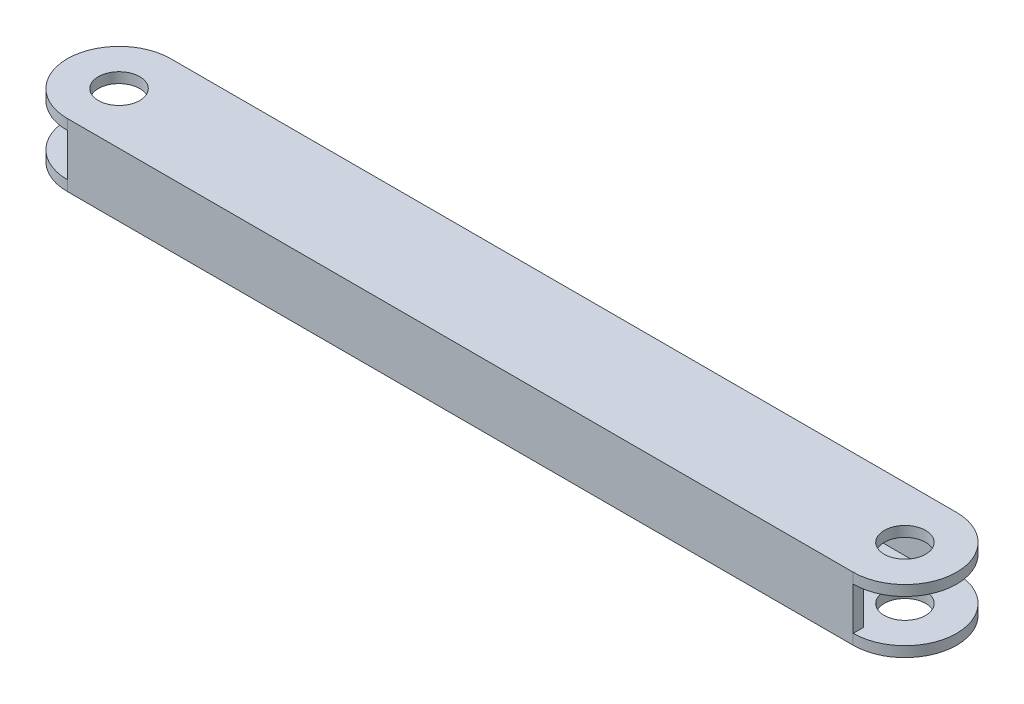
ISO-10303-21;
HEADER;
FILE_DESCRIPTION(('STEP AP214'),'2;1');
FILE_NAME('part.step','',(''),(''),'','','');
FILE_SCHEMA(('AUTOMOTIVE_DESIGN { 1 0 10303 214 1 1 1 1 }'));
ENDSEC;
DATA;
#1=APPLICATION_CONTEXT('core data for automotive mechanical design processes');
#2=APPLICATION_PROTOCOL_DEFINITION('international standard','automotive_design',2000,#1);
#3=PRODUCT_CONTEXT('',#1,'mechanical');
#4=PRODUCT('Part','Part','',(#3));
#5=PRODUCT_RELATED_PRODUCT_CATEGORY('part','',(#4));
#6=PRODUCT_DEFINITION_FORMATION('','',#4);
#7=PRODUCT_DEFINITION_CONTEXT('part definition',#1,'design');
#8=PRODUCT_DEFINITION('design','',#6,#7);
#9=PRODUCT_DEFINITION_SHAPE('','',#8);
#10=(LENGTH_UNIT() NAMED_UNIT(*) SI_UNIT(.MILLI.,.METRE.));
#11=(NAMED_UNIT(*) PLANE_ANGLE_UNIT() SI_UNIT($,.RADIAN.));
#12=(NAMED_UNIT(*) SI_UNIT($,.STERADIAN.) SOLID_ANGLE_UNIT());
#13=UNCERTAINTY_MEASURE_WITH_UNIT(LENGTH_MEASURE(1.E-05),#10,'distance_accuracy_value','');
#14=(GEOMETRIC_REPRESENTATION_CONTEXT(3) GLOBAL_UNCERTAINTY_ASSIGNED_CONTEXT((#13)) GLOBAL_UNIT_ASSIGNED_CONTEXT((#10,
#11,#12)) REPRESENTATION_CONTEXT('',''));
#15=CARTESIAN_POINT('',(0.,0.,0.));
#16=DIRECTION('',(0.,0.,1.));
#17=DIRECTION('',(1.,0.,0.));
#18=AXIS2_PLACEMENT_3D('',#15,#16,#17);
#19=CARTESIAN_POINT('',(-31.9840145157425,6.11675332334781,5.));
#20=DIRECTION('',(0.,1.,0.));
#21=DIRECTION('',(0.,0.,1.));
#22=AXIS2_PLACEMENT_3D('',#19,#20,#21);
#23=CYLINDRICAL_SURFACE('',#22,5.);
#24=DIRECTION('',(0.,1.,0.));
#25=VECTOR('',#24,1.);
#26=CARTESIAN_POINT('',(-31.9840145157425,0.,0.));
#27=LINE('',#26,#25);
#28=CARTESIAN_POINT('',(-31.9840145157425,5.11675332334781,0.));
#29=VERTEX_POINT('',#28);
#30=CARTESIAN_POINT('',(-31.9840145157425,6.11675332334781,0.));
#31=VERTEX_POINT('',#30);
#32=EDGE_CURVE('E252',#29,#31,#27,.T.);
#33=ORIENTED_EDGE('',*,*,#32,.F.);
#34=CARTESIAN_POINT('',(-31.9840145157425,5.11675332334781,5.));
#35=DIRECTION('',(0.,1.,0.));
#36=DIRECTION('',(0.,0.,1.));
#37=AXIS2_PLACEMENT_3D('',#34,#35,#36);
#38=CIRCLE('',#37,5.);
#39=CARTESIAN_POINT('',(-31.9840145157425,5.11675332334781,10.));
#40=VERTEX_POINT('',#39);
#41=EDGE_CURVE('E178',#29,#40,#38,.T.);
#42=ORIENTED_EDGE('',*,*,#41,.T.);
#43=DIRECTION('',(0.,-1.,0.));
#44=VECTOR('',#43,1.);
#45=CARTESIAN_POINT('',(-31.9840145157425,6.11675332334781,10.));
#46=LINE('',#45,#44);
#47=CARTESIAN_POINT('',(-31.9840145157425,6.11675332334781,10.));
#48=VERTEX_POINT('',#47);
#49=EDGE_CURVE('E249',#48,#40,#46,.T.);
#50=ORIENTED_EDGE('',*,*,#49,.F.);
#51=CARTESIAN_POINT('',(-31.9840145157425,6.11675332334781,5.));
#52=DIRECTION('',(0.,1.,0.));
#53=DIRECTION('',(0.,0.,1.));
#54=AXIS2_PLACEMENT_3D('',#51,#52,#53);
#55=CIRCLE('',#54,5.);
#56=EDGE_CURVE('E49',#31,#48,#55,.T.);
#57=ORIENTED_EDGE('',*,*,#56,.F.);
#58=EDGE_LOOP('',(#33,#42,#50,#57));
#59=FACE_BOUND('',#58,.T.);
#60=ADVANCED_FACE('F41',(#59),#23,.T.);
#61=CARTESIAN_POINT('',(-31.9840145157425,1.,10.));
#62=VERTEX_POINT('',#61);
#63=CARTESIAN_POINT('',(-31.9840145157425,0.,10.));
#64=VERTEX_POINT('',#63);
#65=EDGE_CURVE('E248',#62,#64,#46,.T.);
#66=ORIENTED_EDGE('',*,*,#65,.F.);
#67=CARTESIAN_POINT('',(-31.9840145157425,1.,5.));
#68=DIRECTION('',(0.,1.,0.));
#69=DIRECTION('',(0.,0.,1.));
#70=AXIS2_PLACEMENT_3D('',#67,#68,#69);
#71=CIRCLE('',#70,5.);
#72=CARTESIAN_POINT('',(-31.9840145157425,1.,0.));
#73=VERTEX_POINT('',#72);
#74=EDGE_CURVE('E135',#62,#73,#71,.F.);
#75=ORIENTED_EDGE('',*,*,#74,.T.);
#76=CARTESIAN_POINT('',(-31.9840145157425,0.,0.));
#77=VERTEX_POINT('',#76);
#78=EDGE_CURVE('E253',#77,#73,#27,.T.);
#79=ORIENTED_EDGE('',*,*,#78,.F.);
#80=CARTESIAN_POINT('',(-31.9840145157425,0.,5.));
#81=DIRECTION('',(0.,1.,0.));
#82=DIRECTION('',(0.,0.,1.));
#83=AXIS2_PLACEMENT_3D('',#80,#81,#82);
#84=CIRCLE('',#83,5.);
#85=EDGE_CURVE('E11',#64,#77,#84,.F.);
#86=ORIENTED_EDGE('',*,*,#85,.F.);
#87=EDGE_LOOP('',(#66,#75,#79,#86));
#88=FACE_BOUND('',#87,.T.);
#89=ADVANCED_FACE('F292',(#88),#23,.T.);
#90=CARTESIAN_POINT('',(43.9647617048358,0.,5.));
#91=DIRECTION('',(0.,1.,0.));
#92=DIRECTION('',(0.,0.,1.));
#93=AXIS2_PLACEMENT_3D('',#90,#91,#92);
#94=CYLINDRICAL_SURFACE('',#93,5.);
#95=DIRECTION('',(0.,-1.,0.));
#96=VECTOR('',#95,1.);
#97=CARTESIAN_POINT('',(43.9647617048358,0.,0.));
#98=LINE('',#97,#96);
#99=CARTESIAN_POINT('',(43.9647617048358,1.,0.));
#100=VERTEX_POINT('',#99);
#101=CARTESIAN_POINT('',(43.9647617048358,0.,0.));
#102=VERTEX_POINT('',#101);
#103=EDGE_CURVE('E238',#100,#102,#98,.T.);
#104=ORIENTED_EDGE('',*,*,#103,.F.);
#105=CARTESIAN_POINT('',(43.9647617048358,1.,5.));
#106=DIRECTION('',(0.,1.,0.));
#107=DIRECTION('',(0.,0.,1.));
#108=AXIS2_PLACEMENT_3D('',#105,#106,#107);
#109=CIRCLE('',#108,5.);
#110=CARTESIAN_POINT('',(43.9647617048358,1.,10.));
#111=VERTEX_POINT('',#110);
#112=EDGE_CURVE('E200',#100,#111,#109,.F.);
#113=ORIENTED_EDGE('',*,*,#112,.T.);
#114=DIRECTION('',(0.,1.,0.));
#115=VECTOR('',#114,1.);
#116=CARTESIAN_POINT('',(43.9647617048358,0.,10.));
#117=LINE('',#116,#115);
#118=CARTESIAN_POINT('',(43.9647617048358,0.,10.));
#119=VERTEX_POINT('',#118);
#120=EDGE_CURVE('E235',#119,#111,#117,.T.);
#121=ORIENTED_EDGE('',*,*,#120,.F.);
#122=CARTESIAN_POINT('',(43.9647617048358,0.,5.));
#123=DIRECTION('',(0.,1.,0.));
#124=DIRECTION('',(0.,0.,1.));
#125=AXIS2_PLACEMENT_3D('',#122,#123,#124);
#126=CIRCLE('',#125,5.);
#127=EDGE_CURVE('E242',#102,#119,#126,.F.);
#128=ORIENTED_EDGE('',*,*,#127,.F.);
#129=EDGE_LOOP('',(#104,#113,#121,#128));
#130=FACE_BOUND('',#129,.T.);
#131=ADVANCED_FACE('F286',(#130),#94,.T.);
#132=CARTESIAN_POINT('',(43.9647617048358,5.11675332334781,10.));
#133=VERTEX_POINT('',#132);
#134=CARTESIAN_POINT('',(43.9647617048358,6.11675332334781,10.));
#135=VERTEX_POINT('',#134);
#136=EDGE_CURVE('E231',#133,#135,#117,.T.);
#137=ORIENTED_EDGE('',*,*,#136,.F.);
#138=CARTESIAN_POINT('',(43.9647617048358,5.11675332334781,5.));
#139=DIRECTION('',(0.,1.,0.));
#140=DIRECTION('',(0.,0.,1.));
#141=AXIS2_PLACEMENT_3D('',#138,#139,#140);
#142=CIRCLE('',#141,5.);
#143=CARTESIAN_POINT('',(43.9647617048358,5.11675332334781,0.));
#144=VERTEX_POINT('',#143);
#145=EDGE_CURVE('E196',#133,#144,#142,.T.);
#146=ORIENTED_EDGE('',*,*,#145,.T.);
#147=CARTESIAN_POINT('',(43.9647617048358,6.11675332334781,0.));
#148=VERTEX_POINT('',#147);
#149=EDGE_CURVE('E239',#148,#144,#98,.T.);
#150=ORIENTED_EDGE('',*,*,#149,.F.);
#151=CARTESIAN_POINT('',(43.9647617048358,6.11675332334781,5.));
#152=DIRECTION('',(0.,1.,0.));
#153=DIRECTION('',(0.,0.,1.));
#154=AXIS2_PLACEMENT_3D('',#151,#152,#153);
#155=CIRCLE('',#154,5.);
#156=EDGE_CURVE('E245',#135,#148,#155,.T.);
#157=ORIENTED_EDGE('',*,*,#156,.F.);
#158=EDGE_LOOP('',(#137,#146,#150,#157));
#159=FACE_BOUND('',#158,.T.);
#160=ADVANCED_FACE('F269',(#159),#94,.T.);
#161=CARTESIAN_POINT('',(-31.9840145157425,-3.88324667665219,5.));
#162=DIRECTION('',(0.,1.,0.));
#163=DIRECTION('',(0.,0.,1.));
#164=AXIS2_PLACEMENT_3D('',#161,#162,#163);
#165=CYLINDRICAL_SURFACE('',#164,2.);
#166=CARTESIAN_POINT('',(-31.9840145157425,6.11675332334781,5.));
#167=DIRECTION('',(0.,1.,0.));
#168=DIRECTION('',(0.,0.,1.));
#169=AXIS2_PLACEMENT_3D('',#166,#167,#168);
#170=CIRCLE('',#169,2.);
#171=CARTESIAN_POINT('',(-31.9840145157425,6.11675332334781,7.));
#172=VERTEX_POINT('',#171);
#173=EDGE_CURVE('E191',#172,#172,#170,.T.);
#174=ORIENTED_EDGE('',*,*,#173,.T.);
#175=EDGE_LOOP('',(#174));
#176=FACE_BOUND('',#175,.T.);
#177=CARTESIAN_POINT('',(-31.9840145157425,5.11675332334781,5.));
#178=DIRECTION('',(0.,1.,0.));
#179=DIRECTION('',(0.,0.,1.));
#180=AXIS2_PLACEMENT_3D('',#177,#178,#179);
#181=CIRCLE('',#180,2.);
#182=CARTESIAN_POINT('',(-31.9840145157425,5.11675332334781,7.));
#183=VERTEX_POINT('',#182);
#184=EDGE_CURVE('E208',#183,#183,#181,.T.);
#185=ORIENTED_EDGE('',*,*,#184,.F.);
#186=EDGE_LOOP('',(#185));
#187=FACE_BOUND('',#186,.T.);
#188=ADVANCED_FACE('F348',(#176,#187),#165,.F.);
#189=CARTESIAN_POINT('',(43.9647617048359,-3.88324667665219,5.));
#190=DIRECTION('',(0.,1.,0.));
#191=DIRECTION('',(0.,0.,1.));
#192=AXIS2_PLACEMENT_3D('',#189,#190,#191);
#193=CYLINDRICAL_SURFACE('',#192,2.);
#194=CARTESIAN_POINT('',(43.9647617048359,6.11675332334781,5.));
#195=DIRECTION('',(0.,1.,0.));
#196=DIRECTION('',(0.,0.,1.));
#197=AXIS2_PLACEMENT_3D('',#194,#195,#196);
#198=CIRCLE('',#197,2.);
#199=CARTESIAN_POINT('',(43.9647617048359,6.11675332334781,7.));
#200=VERTEX_POINT('',#199);
#201=EDGE_CURVE('E213',#200,#200,#198,.T.);
#202=ORIENTED_EDGE('',*,*,#201,.T.);
#203=EDGE_LOOP('',(#202));
#204=FACE_BOUND('',#203,.T.);
#205=CARTESIAN_POINT('',(43.9647617048359,5.11675332334781,5.));
#206=DIRECTION('',(0.,1.,0.));
#207=DIRECTION('',(0.,0.,1.));
#208=AXIS2_PLACEMENT_3D('',#205,#206,#207);
#209=CIRCLE('',#208,2.);
#210=CARTESIAN_POINT('',(43.9647617048359,5.11675332334781,7.));
#211=VERTEX_POINT('',#210);
#212=EDGE_CURVE('E174',#211,#211,#209,.T.);
#213=ORIENTED_EDGE('',*,*,#212,.F.);
#214=EDGE_LOOP('',(#213));
#215=FACE_BOUND('',#214,.T.);
#216=ADVANCED_FACE('F315',(#204,#215),#193,.F.);
#217=CARTESIAN_POINT('',(-36.9840145157425,0.,10.));
#218=DIRECTION('',(0.,1.,0.));
#219=DIRECTION('',(0.,0.,1.));
#220=AXIS2_PLACEMENT_3D('',#217,#218,#219);
#221=PLANE('',#220);
#222=CARTESIAN_POINT('',(43.9647617048359,0.,5.));
#223=DIRECTION('',(0.,1.,0.));
#224=DIRECTION('',(0.,0.,1.));
#225=AXIS2_PLACEMENT_3D('',#222,#223,#224);
#226=CIRCLE('',#225,2.);
#227=CARTESIAN_POINT('',(43.9647617048359,0.,7.));
#228=VERTEX_POINT('',#227);
#229=EDGE_CURVE('E221',#228,#228,#226,.T.);
#230=ORIENTED_EDGE('',*,*,#229,.T.);
#231=EDGE_LOOP('',(#230));
#232=FACE_BOUND('',#231,.T.);
#233=CARTESIAN_POINT('',(-31.9840145157425,0.,5.));
#234=DIRECTION('',(0.,1.,0.));
#235=DIRECTION('',(0.,0.,1.));
#236=AXIS2_PLACEMENT_3D('',#233,#234,#235);
#237=CIRCLE('',#236,2.);
#238=CARTESIAN_POINT('',(-31.9840145157425,0.,7.));
#239=VERTEX_POINT('',#238);
#240=EDGE_CURVE('E216',#239,#239,#237,.T.);
#241=ORIENTED_EDGE('',*,*,#240,.T.);
#242=EDGE_LOOP('',(#241));
#243=FACE_BOUND('',#242,.T.);
#244=DIRECTION('',(1.,0.,0.));
#245=VECTOR('',#244,1.);
#246=CARTESIAN_POINT('',(-36.9840145157425,0.,10.));
#247=LINE('',#246,#245);
#248=EDGE_CURVE('E228',#64,#119,#247,.T.);
#249=ORIENTED_EDGE('',*,*,#248,.F.);
#250=ORIENTED_EDGE('',*,*,#85,.T.);
#251=DIRECTION('',(1.,0.,0.));
#252=VECTOR('',#251,1.);
#253=CARTESIAN_POINT('',(-36.9840145157425,0.,0.));
#254=LINE('',#253,#252);
#255=EDGE_CURVE('E229',#77,#102,#254,.T.);
#256=ORIENTED_EDGE('',*,*,#255,.T.);
#257=ORIENTED_EDGE('',*,*,#127,.T.);
#258=EDGE_LOOP('',(#249,#250,#256,#257));
#259=FACE_BOUND('',#258,.T.);
#260=ADVANCED_FACE('F290',(#232,#243,#259),#221,.F.);
#261=CARTESIAN_POINT('',(-36.9840145157425,6.11675332334781,10.));
#262=DIRECTION('',(0.,1.,0.));
#263=DIRECTION('',(0.,0.,1.));
#264=AXIS2_PLACEMENT_3D('',#261,#262,#263);
#265=PLANE('',#264);
#266=ORIENTED_EDGE('',*,*,#201,.F.);
#267=EDGE_LOOP('',(#266));
#268=FACE_BOUND('',#267,.T.);
#269=ORIENTED_EDGE('',*,*,#173,.F.);
#270=EDGE_LOOP('',(#269));
#271=FACE_BOUND('',#270,.T.);
#272=DIRECTION('',(1.,0.,0.));
#273=VECTOR('',#272,1.);
#274=CARTESIAN_POINT('',(-36.9840145157425,6.11675332334781,0.));
#275=LINE('',#274,#273);
#276=EDGE_CURVE('E224',#31,#148,#275,.T.);
#277=ORIENTED_EDGE('',*,*,#276,.F.);
#278=ORIENTED_EDGE('',*,*,#56,.T.);
#279=DIRECTION('',(1.,0.,0.));
#280=VECTOR('',#279,1.);
#281=CARTESIAN_POINT('',(-36.9840145157425,6.11675332334781,10.));
#282=LINE('',#281,#280);
#283=EDGE_CURVE('E225',#48,#135,#282,.T.);
#284=ORIENTED_EDGE('',*,*,#283,.T.);
#285=ORIENTED_EDGE('',*,*,#156,.T.);
#286=EDGE_LOOP('',(#277,#278,#284,#285));
#287=FACE_BOUND('',#286,.T.);
#288=ADVANCED_FACE('F259',(#268,#271,#287),#265,.T.);
#289=CARTESIAN_POINT('',(0.,0.,10.));
#290=DIRECTION('',(0.,0.,-1.));
#291=DIRECTION('',(-1.,0.,0.));
#292=AXIS2_PLACEMENT_3D('',#289,#290,#291);
#293=PLANE('',#292);
#294=ORIENTED_EDGE('',*,*,#283,.F.);
#295=ORIENTED_EDGE('',*,*,#49,.T.);
#296=DIRECTION('',(0.,-1.,0.));
#297=VECTOR('',#296,1.);
#298=CARTESIAN_POINT('',(-31.9840145157425,6.11675332334781,10.));
#299=LINE('',#298,#297);
#300=EDGE_CURVE('E199',#40,#62,#299,.T.);
#301=ORIENTED_EDGE('',*,*,#300,.T.);
#302=ORIENTED_EDGE('',*,*,#65,.T.);
#303=ORIENTED_EDGE('',*,*,#248,.T.);
#304=ORIENTED_EDGE('',*,*,#120,.T.);
#305=DIRECTION('',(0.,1.,0.));
#306=VECTOR('',#305,1.);
#307=CARTESIAN_POINT('',(43.9647617048358,0.,10.));
#308=LINE('',#307,#306);
#309=EDGE_CURVE('E153',#111,#133,#308,.T.);
#310=ORIENTED_EDGE('',*,*,#309,.T.);
#311=ORIENTED_EDGE('',*,*,#136,.T.);
#312=EDGE_LOOP('',(#294,#295,#301,#302,#303,#304,#310,#311));
#313=FACE_BOUND('',#312,.T.);
#314=ADVANCED_FACE('F266',(#313),#293,.F.);
#315=CARTESIAN_POINT('',(0.,0.,0.));
#316=DIRECTION('',(0.,0.,-1.));
#317=DIRECTION('',(-1.,0.,0.));
#318=AXIS2_PLACEMENT_3D('',#315,#316,#317);
#319=PLANE('',#318);
#320=ORIENTED_EDGE('',*,*,#255,.F.);
#321=ORIENTED_EDGE('',*,*,#78,.T.);
#322=DIRECTION('',(0.,1.,0.));
#323=VECTOR('',#322,1.);
#324=CARTESIAN_POINT('',(-31.9840145157425,0.,0.));
#325=LINE('',#324,#323);
#326=EDGE_CURVE('E163',#73,#29,#325,.T.);
#327=ORIENTED_EDGE('',*,*,#326,.T.);
#328=ORIENTED_EDGE('',*,*,#32,.T.);
#329=ORIENTED_EDGE('',*,*,#276,.T.);
#330=ORIENTED_EDGE('',*,*,#149,.T.);
#331=DIRECTION('',(0.,-1.,0.));
#332=VECTOR('',#331,1.);
#333=CARTESIAN_POINT('',(43.9647617048358,0.,0.));
#334=LINE('',#333,#332);
#335=EDGE_CURVE('E157',#144,#100,#334,.T.);
#336=ORIENTED_EDGE('',*,*,#335,.T.);
#337=ORIENTED_EDGE('',*,*,#103,.T.);
#338=EDGE_LOOP('',(#320,#321,#327,#328,#329,#330,#336,#337));
#339=FACE_BOUND('',#338,.T.);
#340=ADVANCED_FACE('F274',(#339),#319,.T.);
#341=CARTESIAN_POINT('',(-31.9840145157425,1.,5.));
#342=DIRECTION('',(0.,1.,0.));
#343=DIRECTION('',(0.,0.,1.));
#344=AXIS2_PLACEMENT_3D('',#341,#342,#343);
#345=CIRCLE('',#344,2.);
#346=CARTESIAN_POINT('',(-31.9840145157425,1.,7.));
#347=VERTEX_POINT('',#346);
#348=EDGE_CURVE('E172',#347,#347,#345,.T.);
#349=ORIENTED_EDGE('',*,*,#348,.T.);
#350=EDGE_LOOP('',(#349));
#351=FACE_BOUND('',#350,.T.);
#352=ORIENTED_EDGE('',*,*,#240,.F.);
#353=EDGE_LOOP('',(#352));
#354=FACE_BOUND('',#353,.T.);
#355=ADVANCED_FACE('F336',(#351,#354),#165,.F.);
#356=CARTESIAN_POINT('',(43.9647617048359,1.,5.));
#357=DIRECTION('',(0.,1.,0.));
#358=DIRECTION('',(0.,0.,1.));
#359=AXIS2_PLACEMENT_3D('',#356,#357,#358);
#360=CIRCLE('',#359,2.);
#361=CARTESIAN_POINT('',(43.9647617048359,1.,7.));
#362=VERTEX_POINT('',#361);
#363=EDGE_CURVE('E169',#362,#362,#360,.T.);
#364=ORIENTED_EDGE('',*,*,#363,.T.);
#365=EDGE_LOOP('',(#364));
#366=FACE_BOUND('',#365,.T.);
#367=ORIENTED_EDGE('',*,*,#229,.F.);
#368=EDGE_LOOP('',(#367));
#369=FACE_BOUND('',#368,.T.);
#370=ADVANCED_FACE('F345',(#366,#369),#193,.F.);
#371=CARTESIAN_POINT('',(43.9647617048358,3.0583766616739,0.));
#372=DIRECTION('',(1.,0.,0.));
#373=DIRECTION('',(0.,-1.,0.));
#374=AXIS2_PLACEMENT_3D('',#371,#372,#373);
#375=PLANE('',#374);
#376=ORIENTED_EDGE('',*,*,#335,.F.);
#377=DIRECTION('',(0.,0.,1.));
#378=VECTOR('',#377,1.);
#379=CARTESIAN_POINT('',(43.9647617048358,5.11675332334781,0.));
#380=LINE('',#379,#378);
#381=CARTESIAN_POINT('',(43.9647617048358,5.11675332334781,1.));
#382=VERTEX_POINT('',#381);
#383=EDGE_CURVE('E64',#382,#144,#380,.F.);
#384=ORIENTED_EDGE('',*,*,#383,.F.);
#385=DIRECTION('',(0.,1.,0.));
#386=VECTOR('',#385,1.);
#387=CARTESIAN_POINT('',(43.9647617048358,3.0583766616739,1.));
#388=LINE('',#387,#386);
#389=CARTESIAN_POINT('',(43.9647617048358,1.,1.));
#390=VERTEX_POINT('',#389);
#391=EDGE_CURVE('E177',#382,#390,#388,.F.);
#392=ORIENTED_EDGE('',*,*,#391,.T.);
#393=DIRECTION('',(0.,0.,1.));
#394=VECTOR('',#393,1.);
#395=CARTESIAN_POINT('',(43.9647617048358,1.,0.));
#396=LINE('',#395,#394);
#397=EDGE_CURVE('E188',#390,#100,#396,.F.);
#398=ORIENTED_EDGE('',*,*,#397,.T.);
#399=EDGE_LOOP('',(#376,#384,#392,#398));
#400=FACE_BOUND('',#399,.T.);
#401=ADVANCED_FACE('F355',(#400),#375,.T.);
#402=CARTESIAN_POINT('',(43.9647617048358,3.0583766616739,10.));
#403=DIRECTION('',(1.,0.,0.));
#404=DIRECTION('',(0.,1.,0.));
#405=AXIS2_PLACEMENT_3D('',#402,#403,#404);
#406=PLANE('',#405);
#407=ORIENTED_EDGE('',*,*,#309,.F.);
#408=DIRECTION('',(0.,0.,1.));
#409=VECTOR('',#408,1.);
#410=CARTESIAN_POINT('',(43.9647617048358,1.,10.));
#411=LINE('',#410,#409);
#412=CARTESIAN_POINT('',(43.9647617048358,1.,9.));
#413=VERTEX_POINT('',#412);
#414=EDGE_CURVE('E184',#413,#111,#411,.T.);
#415=ORIENTED_EDGE('',*,*,#414,.F.);
#416=DIRECTION('',(0.,-1.,0.));
#417=VECTOR('',#416,1.);
#418=CARTESIAN_POINT('',(43.9647617048358,0.,9.));
#419=LINE('',#418,#417);
#420=CARTESIAN_POINT('',(43.9647617048358,5.11675332334781,9.));
#421=VERTEX_POINT('',#420);
#422=EDGE_CURVE('E152',#413,#421,#419,.F.);
#423=ORIENTED_EDGE('',*,*,#422,.T.);
#424=DIRECTION('',(0.,0.,-1.));
#425=VECTOR('',#424,1.);
#426=CARTESIAN_POINT('',(43.9647617048358,5.11675332334781,10.));
#427=LINE('',#426,#425);
#428=EDGE_CURVE('E195',#421,#133,#427,.F.);
#429=ORIENTED_EDGE('',*,*,#428,.T.);
#430=EDGE_LOOP('',(#407,#415,#423,#429));
#431=FACE_BOUND('',#430,.T.);
#432=ADVANCED_FACE('F282',(#431),#406,.T.);
#433=CARTESIAN_POINT('',(-31.9840145157425,3.0583766616739,0.));
#434=DIRECTION('',(-1.,0.,0.));
#435=DIRECTION('',(0.,1.,0.));
#436=AXIS2_PLACEMENT_3D('',#433,#434,#435);
#437=PLANE('',#436);
#438=ORIENTED_EDGE('',*,*,#326,.F.);
#439=DIRECTION('',(0.,0.,-1.));
#440=VECTOR('',#439,1.);
#441=CARTESIAN_POINT('',(-31.9840145157425,1.,0.));
#442=LINE('',#441,#440);
#443=CARTESIAN_POINT('',(-31.9840145157425,1.,1.));
#444=VERTEX_POINT('',#443);
#445=EDGE_CURVE('E56',#444,#73,#442,.T.);
#446=ORIENTED_EDGE('',*,*,#445,.F.);
#447=DIRECTION('',(0.,-1.,0.));
#448=VECTOR('',#447,1.);
#449=CARTESIAN_POINT('',(-31.9840145157425,3.0583766616739,1.));
#450=LINE('',#449,#448);
#451=CARTESIAN_POINT('',(-31.9840145157425,5.11675332334781,1.));
#452=VERTEX_POINT('',#451);
#453=EDGE_CURVE('E147',#444,#452,#450,.F.);
#454=ORIENTED_EDGE('',*,*,#453,.T.);
#455=DIRECTION('',(0.,0.,1.));
#456=VECTOR('',#455,1.);
#457=CARTESIAN_POINT('',(-31.9840145157425,5.11675332334781,10.));
#458=LINE('',#457,#456);
#459=EDGE_CURVE('E181',#452,#29,#458,.F.);
#460=ORIENTED_EDGE('',*,*,#459,.T.);
#461=EDGE_LOOP('',(#438,#446,#454,#460));
#462=FACE_BOUND('',#461,.T.);
#463=ADVANCED_FACE('F435',(#462),#437,.T.);
#464=CARTESIAN_POINT('',(-31.9840145157425,3.0583766616739,10.));
#465=DIRECTION('',(-1.,0.,0.));
#466=DIRECTION('',(0.,-1.,0.));
#467=AXIS2_PLACEMENT_3D('',#464,#465,#466);
#468=PLANE('',#467);
#469=ORIENTED_EDGE('',*,*,#300,.F.);
#470=DIRECTION('',(0.,0.,-1.));
#471=VECTOR('',#470,1.);
#472=CARTESIAN_POINT('',(-31.9840145157425,5.11675332334781,10.));
#473=LINE('',#472,#471);
#474=CARTESIAN_POINT('',(-31.9840145157425,5.11675332334781,9.));
#475=VERTEX_POINT('',#474);
#476=EDGE_CURVE('E138',#475,#40,#473,.F.);
#477=ORIENTED_EDGE('',*,*,#476,.F.);
#478=DIRECTION('',(0.,1.,0.));
#479=VECTOR('',#478,1.);
#480=CARTESIAN_POINT('',(-31.9840145157425,0.,9.));
#481=LINE('',#480,#479);
#482=CARTESIAN_POINT('',(-31.9840145157425,1.,9.));
#483=VERTEX_POINT('',#482);
#484=EDGE_CURVE('E141',#475,#483,#481,.F.);
#485=ORIENTED_EDGE('',*,*,#484,.T.);
#486=DIRECTION('',(0.,0.,-1.));
#487=VECTOR('',#486,1.);
#488=CARTESIAN_POINT('',(-31.9840145157425,1.,10.));
#489=LINE('',#488,#487);
#490=EDGE_CURVE('E128',#483,#62,#489,.F.);
#491=ORIENTED_EDGE('',*,*,#490,.T.);
#492=EDGE_LOOP('',(#469,#477,#485,#491));
#493=FACE_BOUND('',#492,.T.);
#494=ADVANCED_FACE('F142',(#493),#468,.T.);
#495=CARTESIAN_POINT('',(-36.9840145157425,1.,10.));
#496=DIRECTION('',(0.,1.,0.));
#497=DIRECTION('',(0.,0.,1.));
#498=AXIS2_PLACEMENT_3D('',#495,#496,#497);
#499=PLANE('',#498);
#500=ORIENTED_EDGE('',*,*,#363,.F.);
#501=EDGE_LOOP('',(#500));
#502=FACE_BOUND('',#501,.T.);
#503=ORIENTED_EDGE('',*,*,#348,.F.);
#504=EDGE_LOOP('',(#503));
#505=FACE_BOUND('',#504,.T.);
#506=DIRECTION('',(1.,0.,0.));
#507=VECTOR('',#506,1.);
#508=CARTESIAN_POINT('',(0.,1.,9.));
#509=LINE('',#508,#507);
#510=EDGE_CURVE('E133',#483,#413,#509,.T.);
#511=ORIENTED_EDGE('',*,*,#510,.T.);
#512=ORIENTED_EDGE('',*,*,#414,.T.);
#513=ORIENTED_EDGE('',*,*,#112,.F.);
#514=ORIENTED_EDGE('',*,*,#397,.F.);
#515=DIRECTION('',(1.,0.,0.));
#516=VECTOR('',#515,1.);
#517=CARTESIAN_POINT('',(0.,1.,1.));
#518=LINE('',#517,#516);
#519=EDGE_CURVE('E159',#444,#390,#518,.T.);
#520=ORIENTED_EDGE('',*,*,#519,.F.);
#521=ORIENTED_EDGE('',*,*,#445,.T.);
#522=ORIENTED_EDGE('',*,*,#74,.F.);
#523=ORIENTED_EDGE('',*,*,#490,.F.);
#524=EDGE_LOOP('',(#511,#512,#513,#514,#520,#521,#522,#523));
#525=FACE_BOUND('',#524,.T.);
#526=ADVANCED_FACE('F130',(#502,#505,#525),#499,.T.);
#527=CARTESIAN_POINT('',(-36.9840145157425,5.11675332334781,10.));
#528=DIRECTION('',(0.,1.,0.));
#529=DIRECTION('',(0.,0.,1.));
#530=AXIS2_PLACEMENT_3D('',#527,#528,#529);
#531=PLANE('',#530);
#532=ORIENTED_EDGE('',*,*,#212,.T.);
#533=EDGE_LOOP('',(#532));
#534=FACE_BOUND('',#533,.T.);
#535=ORIENTED_EDGE('',*,*,#184,.T.);
#536=EDGE_LOOP('',(#535));
#537=FACE_BOUND('',#536,.T.);
#538=DIRECTION('',(1.,0.,0.));
#539=VECTOR('',#538,1.);
#540=CARTESIAN_POINT('',(0.,5.11675332334781,1.));
#541=LINE('',#540,#539);
#542=EDGE_CURVE('E166',#452,#382,#541,.T.);
#543=ORIENTED_EDGE('',*,*,#542,.T.);
#544=ORIENTED_EDGE('',*,*,#383,.T.);
#545=ORIENTED_EDGE('',*,*,#145,.F.);
#546=ORIENTED_EDGE('',*,*,#428,.F.);
#547=DIRECTION('',(1.,0.,0.));
#548=VECTOR('',#547,1.);
#549=CARTESIAN_POINT('',(0.,5.11675332334781,9.));
#550=LINE('',#549,#548);
#551=EDGE_CURVE('E154',#475,#421,#550,.T.);
#552=ORIENTED_EDGE('',*,*,#551,.F.);
#553=ORIENTED_EDGE('',*,*,#476,.T.);
#554=ORIENTED_EDGE('',*,*,#41,.F.);
#555=ORIENTED_EDGE('',*,*,#459,.F.);
#556=EDGE_LOOP('',(#543,#544,#545,#546,#552,#553,#554,#555));
#557=FACE_BOUND('',#556,.T.);
#558=ADVANCED_FACE('F280',(#534,#537,#557),#531,.F.);
#559=CARTESIAN_POINT('',(0.,0.,9.));
#560=DIRECTION('',(0.,0.,-1.));
#561=DIRECTION('',(-1.,0.,0.));
#562=AXIS2_PLACEMENT_3D('',#559,#560,#561);
#563=PLANE('',#562);
#564=ORIENTED_EDGE('',*,*,#551,.T.);
#565=ORIENTED_EDGE('',*,*,#422,.F.);
#566=ORIENTED_EDGE('',*,*,#510,.F.);
#567=ORIENTED_EDGE('',*,*,#484,.F.);
#568=EDGE_LOOP('',(#564,#565,#566,#567));
#569=FACE_BOUND('',#568,.T.);
#570=ADVANCED_FACE('F150',(#569),#563,.T.);
#571=CARTESIAN_POINT('',(0.,0.,1.));
#572=DIRECTION('',(0.,0.,-1.));
#573=DIRECTION('',(-1.,0.,0.));
#574=AXIS2_PLACEMENT_3D('',#571,#572,#573);
#575=PLANE('',#574);
#576=ORIENTED_EDGE('',*,*,#519,.T.);
#577=ORIENTED_EDGE('',*,*,#391,.F.);
#578=ORIENTED_EDGE('',*,*,#542,.F.);
#579=ORIENTED_EDGE('',*,*,#453,.F.);
#580=EDGE_LOOP('',(#576,#577,#578,#579));
#581=FACE_BOUND('',#580,.T.);
#582=ADVANCED_FACE('F410',(#581),#575,.F.);
#583=CLOSED_SHELL('',(#60,#89,#131,#160,#188,#216,#260,#288,#314,#340,#355,#370,#401,#432,#463,
#494,#526,#558,#570,#582));
#584=MANIFOLD_SOLID_BREP('B2',#583);
#585=ADVANCED_BREP_SHAPE_REPRESENTATION('',(#18,#584),#14);
#586=SHAPE_DEFINITION_REPRESENTATION(#9,#585);
ENDSEC;
END-ISO-10303-21;
